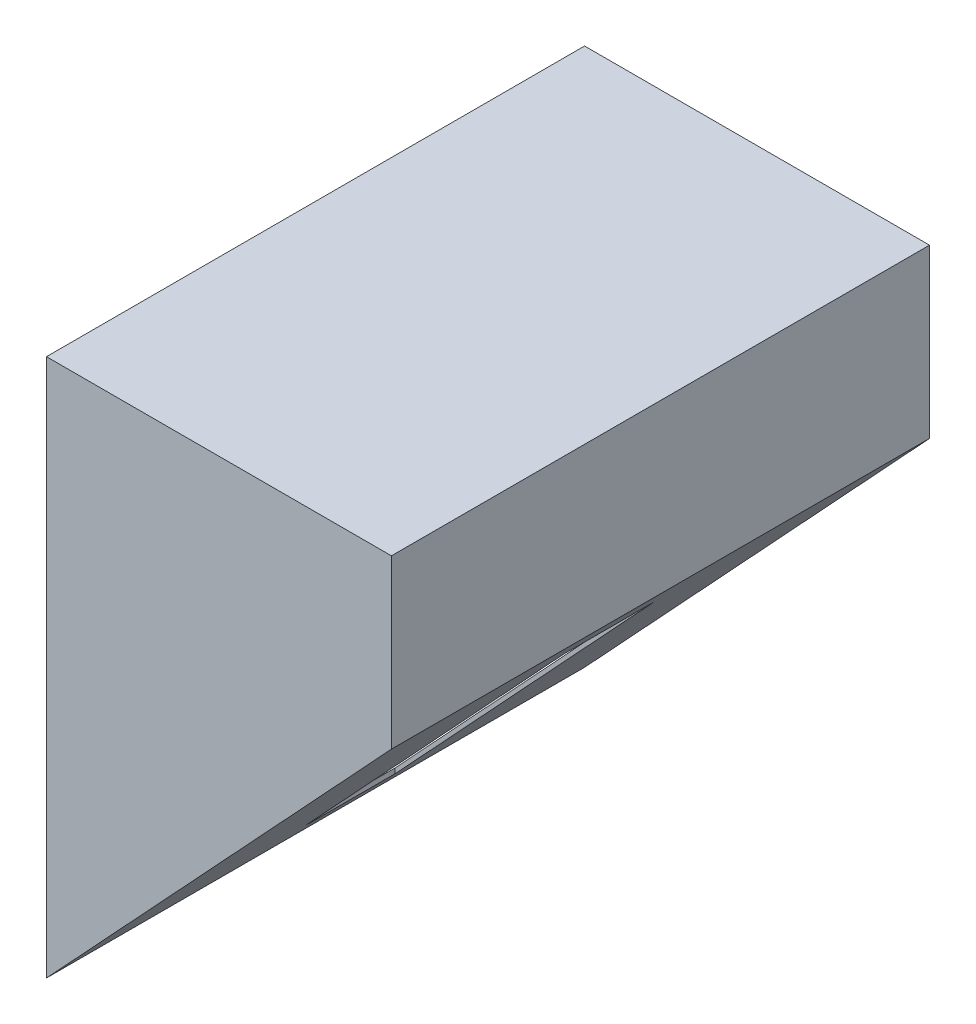
ISO-10303-21;
HEADER;
FILE_DESCRIPTION(('STEP AP214'),'2;1');
FILE_NAME('part.step','',(''),(''),'','','');
FILE_SCHEMA(('AUTOMOTIVE_DESIGN { 1 0 10303 214 1 1 1 1 }'));
ENDSEC;
DATA;
#1=APPLICATION_CONTEXT('core data for automotive mechanical design processes');
#2=APPLICATION_PROTOCOL_DEFINITION('international standard','automotive_design',2000,#1);
#3=PRODUCT_CONTEXT('',#1,'mechanical');
#4=PRODUCT('Part','Part','',(#3));
#5=PRODUCT_RELATED_PRODUCT_CATEGORY('part','',(#4));
#6=PRODUCT_DEFINITION_FORMATION('','',#4);
#7=PRODUCT_DEFINITION_CONTEXT('part definition',#1,'design');
#8=PRODUCT_DEFINITION('design','',#6,#7);
#9=PRODUCT_DEFINITION_SHAPE('','',#8);
#10=(LENGTH_UNIT() NAMED_UNIT(*) SI_UNIT(.MILLI.,.METRE.));
#11=(NAMED_UNIT(*) PLANE_ANGLE_UNIT() SI_UNIT($,.RADIAN.));
#12=(NAMED_UNIT(*) SI_UNIT($,.STERADIAN.) SOLID_ANGLE_UNIT());
#13=UNCERTAINTY_MEASURE_WITH_UNIT(LENGTH_MEASURE(1.E-05),#10,'distance_accuracy_value','');
#14=(GEOMETRIC_REPRESENTATION_CONTEXT(3) GLOBAL_UNCERTAINTY_ASSIGNED_CONTEXT((#13)) GLOBAL_UNIT_ASSIGNED_CONTEXT((#10,
#11,#12)) REPRESENTATION_CONTEXT('',''));
#15=CARTESIAN_POINT('',(0.,0.,0.));
#16=DIRECTION('',(0.,0.,1.));
#17=DIRECTION('',(1.,0.,0.));
#18=AXIS2_PLACEMENT_3D('',#15,#16,#17);
#19=CARTESIAN_POINT('',(0.,0.,0.));
#20=DIRECTION('',(-1.,0.,0.));
#21=DIRECTION('',(0.,0.,1.));
#22=AXIS2_PLACEMENT_3D('',#19,#20,#21);
#23=PLANE('',#22);
#24=DIRECTION('',(0.,1.,0.));
#25=VECTOR('',#24,1.);
#26=CARTESIAN_POINT('',(0.,-112.170076726343,-75.));
#27=LINE('',#26,#25);
#28=CARTESIAN_POINT('',(0.,-112.170076726343,-75.));
#29=VERTEX_POINT('',#28);
#30=CARTESIAN_POINT('',(0.,43.8299232736573,-75.));
#31=VERTEX_POINT('',#30);
#32=EDGE_CURVE('E158',#29,#31,#27,.T.);
#33=ORIENTED_EDGE('',*,*,#32,.F.);
#34=DIRECTION('',(0.,0.,-1.));
#35=VECTOR('',#34,1.);
#36=CARTESIAN_POINT('',(0.,-112.170076726343,81.));
#37=LINE('',#36,#35);
#38=CARTESIAN_POINT('',(0.,-112.170076726343,81.));
#39=VERTEX_POINT('',#38);
#40=EDGE_CURVE('E152',#39,#29,#37,.T.);
#41=ORIENTED_EDGE('',*,*,#40,.F.);
#42=DIRECTION('',(0.,-1.,0.));
#43=VECTOR('',#42,1.);
#44=CARTESIAN_POINT('',(0.,-112.170076726343,81.));
#45=LINE('',#44,#43);
#46=CARTESIAN_POINT('',(0.,43.8299232736573,81.));
#47=VERTEX_POINT('',#46);
#48=EDGE_CURVE('E164',#47,#39,#45,.T.);
#49=ORIENTED_EDGE('',*,*,#48,.F.);
#50=DIRECTION('',(0.,0.,1.));
#51=VECTOR('',#50,1.);
#52=CARTESIAN_POINT('',(0.,43.8299232736573,81.));
#53=LINE('',#52,#51);
#54=EDGE_CURVE('E161',#31,#47,#53,.T.);
#55=ORIENTED_EDGE('',*,*,#54,.F.);
#56=EDGE_LOOP('',(#33,#41,#49,#55));
#57=FACE_BOUND('',#56,.T.);
#58=DIRECTION('',(0.,0.,-1.));
#59=VECTOR('',#58,1.);
#60=CARTESIAN_POINT('',(0.,-110.702160828179,0.));
#61=LINE('',#60,#59);
#62=CARTESIAN_POINT('',(0.,-110.702160828179,80.));
#63=VERTEX_POINT('',#62);
#64=CARTESIAN_POINT('',(0.,-110.702160828179,-74.));
#65=VERTEX_POINT('',#64);
#66=EDGE_CURVE('E218',#63,#65,#61,.T.);
#67=ORIENTED_EDGE('',*,*,#66,.T.);
#68=DIRECTION('',(0.,1.,0.));
#69=VECTOR('',#68,1.);
#70=CARTESIAN_POINT('',(0.,0.,-74.));
#71=LINE('',#70,#69);
#72=CARTESIAN_POINT('',(0.,42.8299232736573,-74.));
#73=VERTEX_POINT('',#72);
#74=EDGE_CURVE('E233',#65,#73,#71,.T.);
#75=ORIENTED_EDGE('',*,*,#74,.T.);
#76=DIRECTION('',(0.,0.,1.));
#77=VECTOR('',#76,1.);
#78=CARTESIAN_POINT('',(0.,42.8299232736573,0.));
#79=LINE('',#78,#77);
#80=CARTESIAN_POINT('',(0.,42.8299232736573,80.));
#81=VERTEX_POINT('',#80);
#82=EDGE_CURVE('E236',#73,#81,#79,.T.);
#83=ORIENTED_EDGE('',*,*,#82,.T.);
#84=DIRECTION('',(0.,-1.,0.));
#85=VECTOR('',#84,1.);
#86=CARTESIAN_POINT('',(0.,0.,80.));
#87=LINE('',#86,#85);
#88=EDGE_CURVE('E56',#81,#63,#87,.T.);
#89=ORIENTED_EDGE('',*,*,#88,.T.);
#90=EDGE_LOOP('',(#67,#75,#83,#89));
#91=FACE_BOUND('',#90,.T.);
#92=ADVANCED_FACE('F33',(#57,#91),#23,.T.);
#93=CARTESIAN_POINT('',(100.,-112.170076726343,-75.));
#94=DIRECTION('',(0.,0.,1.));
#95=DIRECTION('',(1.,0.,0.));
#96=AXIS2_PLACEMENT_3D('',#93,#94,#95);
#97=PLANE('',#96);
#98=DIRECTION('',(0.,1.,0.));
#99=VECTOR('',#98,1.);
#100=CARTESIAN_POINT('',(100.,-112.170076726343,-75.));
#101=LINE('',#100,#99);
#102=CARTESIAN_POINT('',(100.,-4.709521912865,-75.));
#103=VERTEX_POINT('',#102);
#104=CARTESIAN_POINT('',(100.,43.8299232736573,-75.));
#105=VERTEX_POINT('',#104);
#106=EDGE_CURVE('E149',#103,#105,#101,.T.);
#107=ORIENTED_EDGE('',*,*,#106,.F.);
#108=DIRECTION('',(-0.681237938257149,-0.732062068051029,0.));
#109=VECTOR('',#108,1.);
#110=CARTESIAN_POINT('',(100.,-4.709521912865,-75.));
#111=LINE('',#110,#109);
#112=EDGE_CURVE('E179',#103,#29,#111,.T.);
#113=ORIENTED_EDGE('',*,*,#112,.T.);
#114=ORIENTED_EDGE('',*,*,#32,.T.);
#115=DIRECTION('',(-1.,0.,0.));
#116=VECTOR('',#115,1.);
#117=CARTESIAN_POINT('',(100.,43.8299232736573,-75.));
#118=LINE('',#117,#116);
#119=EDGE_CURVE('E41',#105,#31,#118,.T.);
#120=ORIENTED_EDGE('',*,*,#119,.F.);
#121=EDGE_LOOP('',(#107,#113,#114,#120));
#122=FACE_BOUND('',#121,.T.);
#123=ADVANCED_FACE('F35',(#122),#97,.F.);
#124=CARTESIAN_POINT('',(100.,43.8299232736573,81.));
#125=DIRECTION('',(0.,-1.,0.));
#126=DIRECTION('',(0.,0.,-1.));
#127=AXIS2_PLACEMENT_3D('',#124,#125,#126);
#128=PLANE('',#127);
#129=ORIENTED_EDGE('',*,*,#54,.T.);
#130=DIRECTION('',(-1.,0.,0.));
#131=VECTOR('',#130,1.);
#132=CARTESIAN_POINT('',(100.,43.8299232736573,81.));
#133=LINE('',#132,#131);
#134=CARTESIAN_POINT('',(100.,43.8299232736573,81.));
#135=VERTEX_POINT('',#134);
#136=EDGE_CURVE('E157',#135,#47,#133,.T.);
#137=ORIENTED_EDGE('',*,*,#136,.F.);
#138=DIRECTION('',(0.,0.,1.));
#139=VECTOR('',#138,1.);
#140=CARTESIAN_POINT('',(100.,43.8299232736573,81.));
#141=LINE('',#140,#139);
#142=EDGE_CURVE('E151',#105,#135,#141,.T.);
#143=ORIENTED_EDGE('',*,*,#142,.F.);
#144=ORIENTED_EDGE('',*,*,#119,.T.);
#145=EDGE_LOOP('',(#129,#137,#143,#144));
#146=FACE_BOUND('',#145,.T.);
#147=ADVANCED_FACE('F173',(#146),#128,.F.);
#148=CARTESIAN_POINT('',(100.,-112.170076726343,81.));
#149=DIRECTION('',(0.,0.,-1.));
#150=DIRECTION('',(-1.,0.,0.));
#151=AXIS2_PLACEMENT_3D('',#148,#149,#150);
#152=PLANE('',#151);
#153=ORIENTED_EDGE('',*,*,#48,.T.);
#154=DIRECTION('',(-0.681237938257149,-0.732062068051029,0.));
#155=VECTOR('',#154,1.);
#156=CARTESIAN_POINT('',(100.,-4.709521912865,81.));
#157=LINE('',#156,#155);
#158=CARTESIAN_POINT('',(100.,-4.709521912865,81.));
#159=VERTEX_POINT('',#158);
#160=EDGE_CURVE('E188',#159,#39,#157,.T.);
#161=ORIENTED_EDGE('',*,*,#160,.F.);
#162=DIRECTION('',(0.,-1.,0.));
#163=VECTOR('',#162,1.);
#164=CARTESIAN_POINT('',(100.,-112.170076726343,81.));
#165=LINE('',#164,#163);
#166=EDGE_CURVE('E154',#135,#159,#165,.T.);
#167=ORIENTED_EDGE('',*,*,#166,.F.);
#168=ORIENTED_EDGE('',*,*,#136,.T.);
#169=EDGE_LOOP('',(#153,#161,#167,#168));
#170=FACE_BOUND('',#169,.T.);
#171=ADVANCED_FACE('F186',(#170),#152,.F.);
#172=CARTESIAN_POINT('',(100.,0.,0.));
#173=DIRECTION('',(-1.,0.,0.));
#174=DIRECTION('',(0.,0.,1.));
#175=AXIS2_PLACEMENT_3D('',#172,#173,#174);
#176=PLANE('',#175);
#177=ORIENTED_EDGE('',*,*,#166,.T.);
#178=DIRECTION('',(0.,0.,1.));
#179=VECTOR('',#178,1.);
#180=CARTESIAN_POINT('',(100.,-4.709521912865,-75.));
#181=LINE('',#180,#179);
#182=EDGE_CURVE('E192',#103,#159,#181,.T.);
#183=ORIENTED_EDGE('',*,*,#182,.F.);
#184=ORIENTED_EDGE('',*,*,#106,.T.);
#185=ORIENTED_EDGE('',*,*,#142,.T.);
#186=EDGE_LOOP('',(#177,#183,#184,#185));
#187=FACE_BOUND('',#186,.T.);
#188=ADVANCED_FACE('F191',(#187),#176,.F.);
#189=CARTESIAN_POINT('',(100.,-4.709521912865,-75.));
#190=DIRECTION('',(-0.732062068051029,0.681237938257149,0.));
#191=DIRECTION('',(-0.681237938257149,-0.732062068051029,0.));
#192=AXIS2_PLACEMENT_3D('',#189,#190,#191);
#193=PLANE('',#192);
#194=ORIENTED_EDGE('',*,*,#160,.T.);
#195=ORIENTED_EDGE('',*,*,#40,.T.);
#196=ORIENTED_EDGE('',*,*,#112,.F.);
#197=ORIENTED_EDGE('',*,*,#182,.T.);
#198=EDGE_LOOP('',(#194,#195,#196,#197));
#199=FACE_BOUND('',#198,.T.);
#200=DIRECTION('',(0.681237938257149,0.732062068051029,0.));
#201=VECTOR('',#200,1.);
#202=CARTESIAN_POINT('',(89.3180813158071,-16.1883709956233,-9.99999999999999));
#203=LINE('',#202,#201);
#204=CARTESIAN_POINT('',(10.,-101.424021244995,-10.));
#205=VERTEX_POINT('',#204);
#206=CARTESIAN_POINT('',(85.,-20.8286051348867,-9.99999999999999));
#207=VERTEX_POINT('',#206);
#208=EDGE_CURVE('E145',#205,#207,#203,.T.);
#209=ORIENTED_EDGE('',*,*,#208,.F.);
#210=DIRECTION('',(0.,0.,-1.));
#211=VECTOR('',#210,1.);
#212=CARTESIAN_POINT('',(10.,-101.424021244995,16.));
#213=LINE('',#212,#211);
#214=CARTESIAN_POINT('',(10.,-101.424021244995,16.));
#215=VERTEX_POINT('',#214);
#216=EDGE_CURVE('E194',#215,#205,#213,.T.);
#217=ORIENTED_EDGE('',*,*,#216,.F.);
#218=DIRECTION('',(-0.681237938257149,-0.732062068051029,0.));
#219=VECTOR('',#218,1.);
#220=CARTESIAN_POINT('',(89.3180813158071,-16.1883709956233,16.));
#221=LINE('',#220,#219);
#222=CARTESIAN_POINT('',(85.,-20.8286051348867,16.));
#223=VERTEX_POINT('',#222);
#224=EDGE_CURVE('E11',#223,#215,#221,.T.);
#225=ORIENTED_EDGE('',*,*,#224,.F.);
#226=DIRECTION('',(0.,0.,1.));
#227=VECTOR('',#226,1.);
#228=CARTESIAN_POINT('',(85.,-20.8286051348867,16.));
#229=LINE('',#228,#227);
#230=EDGE_CURVE('E141',#207,#223,#229,.T.);
#231=ORIENTED_EDGE('',*,*,#230,.F.);
#232=EDGE_LOOP('',(#209,#217,#225,#231));
#233=FACE_BOUND('',#232,.T.);
#234=ADVANCED_FACE('F210',(#199,#233),#193,.F.);
#235=CARTESIAN_POINT('',(85.,-12.1700767263427,16.));
#236=DIRECTION('',(0.,0.,1.));
#237=DIRECTION('',(1.,0.,0.));
#238=AXIS2_PLACEMENT_3D('',#235,#236,#237);
#239=PLANE('',#238);
#240=DIRECTION('',(0.,-1.,0.));
#241=VECTOR('',#240,1.);
#242=CARTESIAN_POINT('',(10.,-12.1700767263427,16.));
#243=LINE('',#242,#241);
#244=CARTESIAN_POINT('',(10.,-99.9561053468311,16.));
#245=VERTEX_POINT('',#244);
#246=EDGE_CURVE('E134',#245,#215,#243,.T.);
#247=ORIENTED_EDGE('',*,*,#246,.F.);
#248=DIRECTION('',(-0.681237938257149,-0.732062068051029,0.));
#249=VECTOR('',#248,1.);
#250=CARTESIAN_POINT('',(9.00000000000001,-101.030710894966,16.));
#251=LINE('',#250,#249);
#252=CARTESIAN_POINT('',(85.,-19.3606892367228,16.));
#253=VERTEX_POINT('',#252);
#254=EDGE_CURVE('E123',#253,#245,#251,.T.);
#255=ORIENTED_EDGE('',*,*,#254,.F.);
#256=DIRECTION('',(0.,-1.,0.));
#257=VECTOR('',#256,1.);
#258=CARTESIAN_POINT('',(85.,-12.1700767263427,16.));
#259=LINE('',#258,#257);
#260=EDGE_CURVE('E132',#253,#223,#259,.T.);
#261=ORIENTED_EDGE('',*,*,#260,.T.);
#262=ORIENTED_EDGE('',*,*,#224,.T.);
#263=EDGE_LOOP('',(#247,#255,#261,#262));
#264=FACE_BOUND('',#263,.T.);
#265=ADVANCED_FACE('F131',(#264),#239,.F.);
#266=CARTESIAN_POINT('',(10.,-12.1700767263427,16.));
#267=DIRECTION('',(-1.,0.,0.));
#268=DIRECTION('',(0.,0.,1.));
#269=AXIS2_PLACEMENT_3D('',#266,#267,#268);
#270=PLANE('',#269);
#271=DIRECTION('',(0.,-1.,0.));
#272=VECTOR('',#271,1.);
#273=CARTESIAN_POINT('',(10.,-12.1700767263427,-10.));
#274=LINE('',#273,#272);
#275=CARTESIAN_POINT('',(10.,-99.9561053468311,-10.));
#276=VERTEX_POINT('',#275);
#277=EDGE_CURVE('E143',#276,#205,#274,.T.);
#278=ORIENTED_EDGE('',*,*,#277,.F.);
#279=DIRECTION('',(0.,0.,-1.));
#280=VECTOR('',#279,1.);
#281=CARTESIAN_POINT('',(10.,-99.9561053468311,81.001));
#282=LINE('',#281,#280);
#283=EDGE_CURVE('E136',#245,#276,#282,.T.);
#284=ORIENTED_EDGE('',*,*,#283,.F.);
#285=ORIENTED_EDGE('',*,*,#246,.T.);
#286=ORIENTED_EDGE('',*,*,#216,.T.);
#287=EDGE_LOOP('',(#278,#284,#285,#286));
#288=FACE_BOUND('',#287,.T.);
#289=ADVANCED_FACE('F211',(#288),#270,.F.);
#290=CARTESIAN_POINT('',(85.,-12.1700767263427,-9.99999999999999));
#291=DIRECTION('',(0.,0.,-1.));
#292=DIRECTION('',(-1.,0.,0.));
#293=AXIS2_PLACEMENT_3D('',#290,#291,#292);
#294=PLANE('',#293);
#295=DIRECTION('',(0.,-1.,0.));
#296=VECTOR('',#295,1.);
#297=CARTESIAN_POINT('',(85.,-12.1700767263427,-9.99999999999999));
#298=LINE('',#297,#296);
#299=CARTESIAN_POINT('',(85.,-19.3606892367229,-9.99999999999999));
#300=VERTEX_POINT('',#299);
#301=EDGE_CURVE('E162',#300,#207,#298,.T.);
#302=ORIENTED_EDGE('',*,*,#301,.F.);
#303=DIRECTION('',(0.681237938257149,0.732062068051029,0.));
#304=VECTOR('',#303,1.);
#305=CARTESIAN_POINT('',(9.00000000000001,-101.030710894966,-10.));
#306=LINE('',#305,#304);
#307=EDGE_CURVE('E48',#276,#300,#306,.T.);
#308=ORIENTED_EDGE('',*,*,#307,.F.);
#309=ORIENTED_EDGE('',*,*,#277,.T.);
#310=ORIENTED_EDGE('',*,*,#208,.T.);
#311=EDGE_LOOP('',(#302,#308,#309,#310));
#312=FACE_BOUND('',#311,.T.);
#313=ADVANCED_FACE('F206',(#312),#294,.F.);
#314=CARTESIAN_POINT('',(85.,-12.1700767263427,16.));
#315=DIRECTION('',(1.,0.,0.));
#316=DIRECTION('',(0.,0.,-1.));
#317=AXIS2_PLACEMENT_3D('',#314,#315,#316);
#318=PLANE('',#317);
#319=ORIENTED_EDGE('',*,*,#260,.F.);
#320=DIRECTION('',(0.,0.,1.));
#321=VECTOR('',#320,1.);
#322=CARTESIAN_POINT('',(85.,-19.3606892367228,81.001));
#323=LINE('',#322,#321);
#324=EDGE_CURVE('E120',#300,#253,#323,.T.);
#325=ORIENTED_EDGE('',*,*,#324,.F.);
#326=ORIENTED_EDGE('',*,*,#301,.T.);
#327=ORIENTED_EDGE('',*,*,#230,.T.);
#328=EDGE_LOOP('',(#319,#325,#326,#327));
#329=FACE_BOUND('',#328,.T.);
#330=ADVANCED_FACE('F139',(#329),#318,.F.);
#331=CARTESIAN_POINT('',(100.,-112.170076726343,-74.));
#332=DIRECTION('',(0.,0.,1.));
#333=DIRECTION('',(1.,0.,0.));
#334=AXIS2_PLACEMENT_3D('',#331,#332,#333);
#335=PLANE('',#334);
#336=DIRECTION('',(0.,1.,0.));
#337=VECTOR('',#336,1.);
#338=CARTESIAN_POINT('',(99.,0.,-74.));
#339=LINE('',#338,#337);
#340=CARTESIAN_POINT('',(99.,-4.31621156283598,-74.));
#341=VERTEX_POINT('',#340);
#342=CARTESIAN_POINT('',(99.,42.8299232736573,-74.));
#343=VERTEX_POINT('',#342);
#344=EDGE_CURVE('E215',#341,#343,#339,.T.);
#345=ORIENTED_EDGE('',*,*,#344,.T.);
#346=DIRECTION('',(-1.,0.,0.));
#347=VECTOR('',#346,1.);
#348=CARTESIAN_POINT('',(100.,42.8299232736573,-74.));
#349=LINE('',#348,#347);
#350=EDGE_CURVE('E222',#343,#73,#349,.T.);
#351=ORIENTED_EDGE('',*,*,#350,.T.);
#352=ORIENTED_EDGE('',*,*,#74,.F.);
#353=DIRECTION('',(-0.681237938257149,-0.732062068051029,0.));
#354=VECTOR('',#353,1.);
#355=CARTESIAN_POINT('',(45.6764507840341,-61.6179933965508,-74.));
#356=LINE('',#355,#354);
#357=EDGE_CURVE('E219',#341,#65,#356,.T.);
#358=ORIENTED_EDGE('',*,*,#357,.F.);
#359=EDGE_LOOP('',(#345,#351,#352,#358));
#360=FACE_BOUND('',#359,.T.);
#361=ADVANCED_FACE('F246',(#360),#335,.T.);
#362=CARTESIAN_POINT('',(100.,42.8299232736573,81.));
#363=DIRECTION('',(0.,-1.,0.));
#364=DIRECTION('',(0.,0.,-1.));
#365=AXIS2_PLACEMENT_3D('',#362,#363,#364);
#366=PLANE('',#365);
#367=ORIENTED_EDGE('',*,*,#82,.F.);
#368=ORIENTED_EDGE('',*,*,#350,.F.);
#369=DIRECTION('',(0.,0.,1.));
#370=VECTOR('',#369,1.);
#371=CARTESIAN_POINT('',(99.,42.8299232736573,0.));
#372=LINE('',#371,#370);
#373=CARTESIAN_POINT('',(99.,42.8299232736573,80.));
#374=VERTEX_POINT('',#373);
#375=EDGE_CURVE('E217',#343,#374,#372,.T.);
#376=ORIENTED_EDGE('',*,*,#375,.T.);
#377=DIRECTION('',(-1.,0.,0.));
#378=VECTOR('',#377,1.);
#379=CARTESIAN_POINT('',(100.,42.8299232736573,80.));
#380=LINE('',#379,#378);
#381=EDGE_CURVE('E225',#374,#81,#380,.T.);
#382=ORIENTED_EDGE('',*,*,#381,.T.);
#383=EDGE_LOOP('',(#367,#368,#376,#382));
#384=FACE_BOUND('',#383,.T.);
#385=ADVANCED_FACE('F244',(#384),#366,.T.);
#386=CARTESIAN_POINT('',(100.,-112.170076726343,80.));
#387=DIRECTION('',(0.,0.,-1.));
#388=DIRECTION('',(-1.,0.,0.));
#389=AXIS2_PLACEMENT_3D('',#386,#387,#388);
#390=PLANE('',#389);
#391=ORIENTED_EDGE('',*,*,#88,.F.);
#392=ORIENTED_EDGE('',*,*,#381,.F.);
#393=DIRECTION('',(0.,-1.,0.));
#394=VECTOR('',#393,1.);
#395=CARTESIAN_POINT('',(99.,0.,80.));
#396=LINE('',#395,#394);
#397=CARTESIAN_POINT('',(99.,-4.31621156283598,80.));
#398=VERTEX_POINT('',#397);
#399=EDGE_CURVE('E227',#374,#398,#396,.T.);
#400=ORIENTED_EDGE('',*,*,#399,.T.);
#401=DIRECTION('',(-0.681237938257149,-0.732062068051029,0.));
#402=VECTOR('',#401,1.);
#403=CARTESIAN_POINT('',(99.267937931949,-4.02828397460785,80.));
#404=LINE('',#403,#402);
#405=EDGE_CURVE('E135',#398,#63,#404,.T.);
#406=ORIENTED_EDGE('',*,*,#405,.T.);
#407=EDGE_LOOP('',(#391,#392,#400,#406));
#408=FACE_BOUND('',#407,.T.);
#409=ADVANCED_FACE('F253',(#408),#390,.T.);
#410=CARTESIAN_POINT('',(99.,0.,0.));
#411=DIRECTION('',(-1.,0.,0.));
#412=DIRECTION('',(0.,0.,1.));
#413=AXIS2_PLACEMENT_3D('',#410,#411,#412);
#414=PLANE('',#413);
#415=ORIENTED_EDGE('',*,*,#399,.F.);
#416=ORIENTED_EDGE('',*,*,#375,.F.);
#417=ORIENTED_EDGE('',*,*,#344,.F.);
#418=DIRECTION('',(0.,0.,1.));
#419=VECTOR('',#418,1.);
#420=CARTESIAN_POINT('',(99.,-4.31621156283598,-75.));
#421=LINE('',#420,#419);
#422=EDGE_CURVE('E221',#341,#398,#421,.T.);
#423=ORIENTED_EDGE('',*,*,#422,.T.);
#424=EDGE_LOOP('',(#415,#416,#417,#423));
#425=FACE_BOUND('',#424,.T.);
#426=ADVANCED_FACE('F252',(#425),#414,.T.);
#427=CARTESIAN_POINT('',(99.267937931949,-4.02828397460785,-75.));
#428=DIRECTION('',(-0.732062068051029,0.681237938257149,0.));
#429=DIRECTION('',(-0.681237938257149,-0.732062068051029,0.));
#430=AXIS2_PLACEMENT_3D('',#427,#428,#429);
#431=PLANE('',#430);
#432=ORIENTED_EDGE('',*,*,#405,.F.);
#433=ORIENTED_EDGE('',*,*,#422,.F.);
#434=ORIENTED_EDGE('',*,*,#357,.T.);
#435=ORIENTED_EDGE('',*,*,#66,.F.);
#436=EDGE_LOOP('',(#432,#433,#434,#435));
#437=FACE_BOUND('',#436,.T.);
#438=ORIENTED_EDGE('',*,*,#254,.T.);
#439=ORIENTED_EDGE('',*,*,#283,.T.);
#440=ORIENTED_EDGE('',*,*,#307,.T.);
#441=ORIENTED_EDGE('',*,*,#324,.T.);
#442=EDGE_LOOP('',(#438,#439,#440,#441));
#443=FACE_BOUND('',#442,.T.);
#444=ADVANCED_FACE('F122',(#437,#443),#431,.T.);
#445=CLOSED_SHELL('',(#92,#123,#147,#171,#188,#234,#265,#289,#313,#330,#361,#385,#409,#426,#444));
#446=MANIFOLD_SOLID_BREP('B2',#445);
#447=ADVANCED_BREP_SHAPE_REPRESENTATION('',(#18,#446),#14);
#448=SHAPE_DEFINITION_REPRESENTATION(#9,#447);
ENDSEC;
END-ISO-10303-21;
